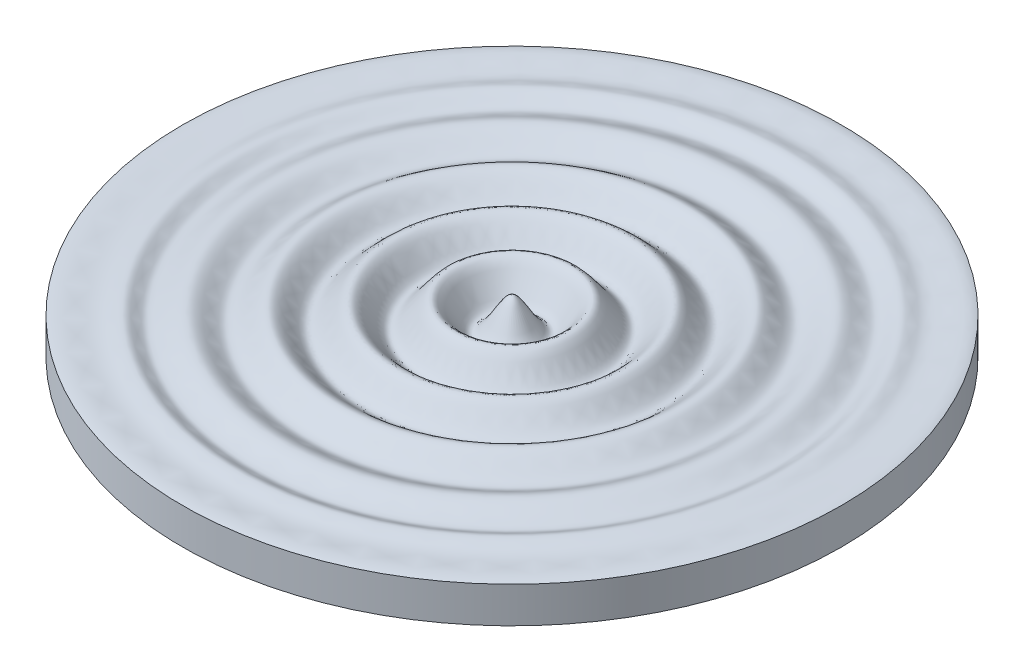
ISO-10303-21;
HEADER;
FILE_DESCRIPTION(('STEP AP214'),'2;1');
FILE_NAME('part.step','',(''),(''),'','','');
FILE_SCHEMA(('AUTOMOTIVE_DESIGN { 1 0 10303 214 1 1 1 1 }'));
ENDSEC;
DATA;
#1=APPLICATION_CONTEXT('core data for automotive mechanical design processes');
#2=APPLICATION_PROTOCOL_DEFINITION('international standard','automotive_design',2000,#1);
#3=PRODUCT_CONTEXT('',#1,'mechanical');
#4=PRODUCT('Part','Part','',(#3));
#5=PRODUCT_RELATED_PRODUCT_CATEGORY('part','',(#4));
#6=PRODUCT_DEFINITION_FORMATION('','',#4);
#7=PRODUCT_DEFINITION_CONTEXT('part definition',#1,'design');
#8=PRODUCT_DEFINITION('design','',#6,#7);
#9=PRODUCT_DEFINITION_SHAPE('','',#8);
#10=(LENGTH_UNIT() NAMED_UNIT(*) SI_UNIT(.MILLI.,.METRE.));
#11=(NAMED_UNIT(*) PLANE_ANGLE_UNIT() SI_UNIT($,.RADIAN.));
#12=(NAMED_UNIT(*) SI_UNIT($,.STERADIAN.) SOLID_ANGLE_UNIT());
#13=UNCERTAINTY_MEASURE_WITH_UNIT(LENGTH_MEASURE(1.E-05),#10,'distance_accuracy_value','');
#14=(GEOMETRIC_REPRESENTATION_CONTEXT(3) GLOBAL_UNCERTAINTY_ASSIGNED_CONTEXT((#13)) GLOBAL_UNIT_ASSIGNED_CONTEXT((#10,
#11,#12)) REPRESENTATION_CONTEXT('',''));
#15=CARTESIAN_POINT('',(0.,0.,0.));
#16=DIRECTION('',(0.,0.,1.));
#17=DIRECTION('',(1.,0.,0.));
#18=AXIS2_PLACEMENT_3D('',#15,#16,#17);
#19=CARTESIAN_POINT('',(0.,24.1441400973485,0.));
#20=CARTESIAN_POINT('',(-12.2097203227199,24.0038909482969,0.));
#21=CARTESIAN_POINT('',(-33.2667146965413,-44.8170190153844,0.));
#22=CARTESIAN_POINT('',(-59.2856914775965,-0.177228887590664,0.));
#23=CARTESIAN_POINT('',(-80.1386612936879,29.9009994948852,0.));
#24=CARTESIAN_POINT('',(-99.2528210903738,0.0782500116787248,0.));
#25=CARTESIAN_POINT('',(-120.117298717049,-26.7351544805056,0.));
#26=CARTESIAN_POINT('',(-139.239489853536,0.0298833447948078,0.));
#27=CARTESIAN_POINT('',(-160.09050100328,23.5693655258665,0.));
#28=CARTESIAN_POINT('',(-179.239234222124,-0.147281170510681,0.));
#29=CARTESIAN_POINT('',(-200.059917928626,-20.4030159599435,0.));
#30=CARTESIAN_POINT('',(-219.254947939355,0.271372316723412,0.));
#31=CARTESIAN_POINT('',(-240.024125117312,17.2362147673639,0.));
#32=CARTESIAN_POINT('',(-259.292775463342,-0.399727216398198,0.));
#33=CARTESIAN_POINT('',(-279.971932068474,-14.0620909243344,0.));
#34=CARTESIAN_POINT('',(-299.129600383465,0.304074245956355,0.));
#35=CARTESIAN_POINT('',(-319.487672971996,10.8531937633878,0.));
#36=CARTESIAN_POINT('',(-339.045386028518,0.0622430960001436,0.));
#37=CARTESIAN_POINT('',(-360.75648205107,-9.86261416722209,0.));
#38=CARTESIAN_POINT('',(-378.777323885455,8.99485699753565,0.));
#39=CARTESIAN_POINT('',(-412.136080411784,-8.27192857473011,0.));
#40=CARTESIAN_POINT('',(-437.918016299156,5.60981025641124,0.));
#41=CARTESIAN_POINT('',(-457.049532744918,0.,0.));
#42=B_SPLINE_CURVE_WITH_KNOTS('',3,(#19,#20,#21,#22,#23,#24,#25,#26,#27,#28,#29,#30,#31,#32,#33,
#34,#35,#36,#37,#38,#39,#40,#41),.UNSPECIFIED.,.F.,.F.,(4,1,1,1,1,1,1,1,1,1,1,1,1,1,1,1,1,1,1,1,
4),(0.,0.110465463154187,0.164248315559078,0.215267975059463,0.266287634559848,
0.314687758840738,0.363087883121628,0.409036706147009,0.454985529172389,0.498679608594794,
0.542373688017206,0.584041502309128,0.625709316601048,0.665614164067297,0.70551901153353,
0.742350470896029,0.782474604619927,0.819787402084104,0.859583539176437,0.896467537238142,1.),.UNSPECIFIED.);
#43=CARTESIAN_POINT('',(3.49148133884313E-12,-1000.,0.));
#44=DIRECTION('',(0.,-1.,0.));
#45=AXIS1_PLACEMENT('',#43,#44);
#46=SURFACE_OF_REVOLUTION('',#42,#45);
#47=CARTESIAN_POINT('',(0.,1.55431223447522E-12,0.));
#48=DIRECTION('',(0.,-1.,0.));
#49=DIRECTION('',(1.,0.,0.));
#50=AXIS2_PLACEMENT_3D('',#47,#48,#49);
#51=CIRCLE('',#50,457.049532744918);
#52=CARTESIAN_POINT('',(457.049532744918,3.15009214898107E-12,0.));
#53=VERTEX_POINT('',#52);
#54=EDGE_CURVE('E42',#53,#53,#51,.T.);
#55=ORIENTED_EDGE('',*,*,#54,.F.);
#56=EDGE_LOOP('',(#55));
#57=FACE_BOUND('',#56,.T.);
#58=CARTESIAN_POINT('',(0.,24.1441400973486,0.));
#59=VERTEX_POINT('',#58);
#60=VERTEX_LOOP('',#59);
#61=FACE_BOUND('',#60,.T.);
#62=ADVANCED_FACE('F35',(#57,#61),#46,.T.);
#63=CARTESIAN_POINT('',(-457.049532744918,-50.0000000000008,0.));
#64=DIRECTION('',(0.,1.,0.));
#65=DIRECTION('',(-1.,0.,0.));
#66=AXIS2_PLACEMENT_3D('',#63,#64,#65);
#67=PLANE('',#66);
#68=CARTESIAN_POINT('',(1.74574066942152E-13,-49.9999999999985,0.));
#69=DIRECTION('',(0.,-1.,0.));
#70=DIRECTION('',(1.,0.,0.));
#71=AXIS2_PLACEMENT_3D('',#68,#69,#70);
#72=CIRCLE('',#71,457.049532744918);
#73=CARTESIAN_POINT('',(457.049532744918,-49.9999999999969,0.));
#74=VERTEX_POINT('',#73);
#75=EDGE_CURVE('E11',#74,#74,#72,.T.);
#76=ORIENTED_EDGE('',*,*,#75,.T.);
#77=EDGE_LOOP('',(#76));
#78=FACE_BOUND('',#77,.T.);
#79=ADVANCED_FACE('F46',(#78),#67,.F.);
#80=CARTESIAN_POINT('',(3.49148133884313E-12,-1000.,0.));
#81=DIRECTION('',(0.,-1.,0.));
#82=DIRECTION('',(1.,0.,0.));
#83=AXIS2_PLACEMENT_3D('',#80,#81,#82);
#84=CYLINDRICAL_SURFACE('',#83,457.049532744918);
#85=ORIENTED_EDGE('',*,*,#75,.F.);
#86=EDGE_LOOP('',(#85));
#87=FACE_BOUND('',#86,.T.);
#88=ORIENTED_EDGE('',*,*,#54,.T.);
#89=EDGE_LOOP('',(#88));
#90=FACE_BOUND('',#89,.T.);
#91=ADVANCED_FACE('F51',(#87,#90),#84,.T.);
#92=CLOSED_SHELL('',(#62,#79,#91));
#93=MANIFOLD_SOLID_BREP('B2',#92);
#94=ADVANCED_BREP_SHAPE_REPRESENTATION('',(#18,#93),#14);
#95=SHAPE_DEFINITION_REPRESENTATION(#9,#94);
ENDSEC;
END-ISO-10303-21;
